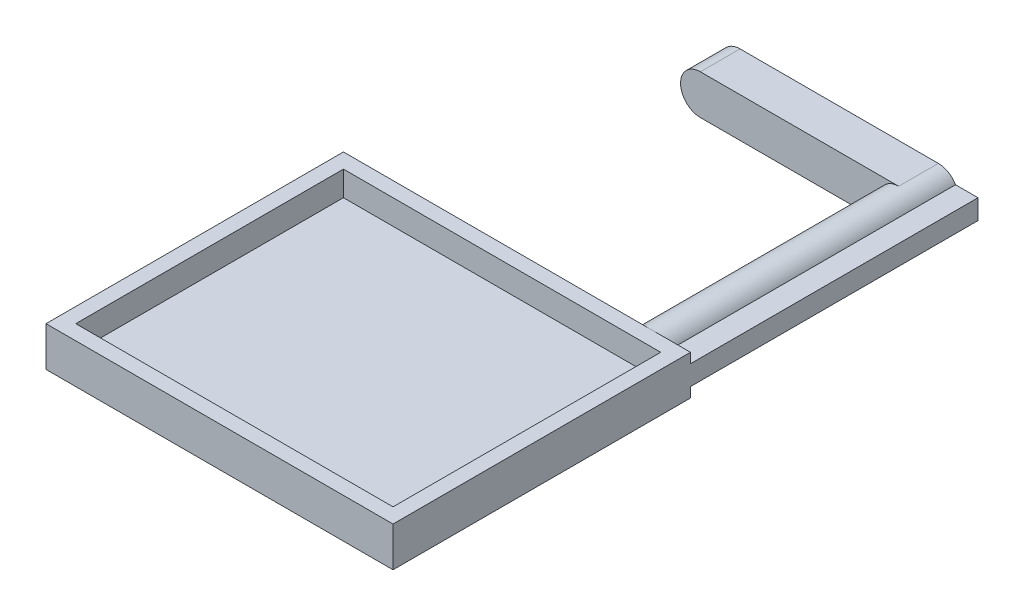
ISO-10303-21;
HEADER;
FILE_DESCRIPTION(('STEP AP214'),'2;1');
FILE_NAME('part.step','',(''),(''),'','','');
FILE_SCHEMA(('AUTOMOTIVE_DESIGN { 1 0 10303 214 1 1 1 1 }'));
ENDSEC;
DATA;
#1=APPLICATION_CONTEXT('core data for automotive mechanical design processes');
#2=APPLICATION_PROTOCOL_DEFINITION('international standard','automotive_design',2000,#1);
#3=PRODUCT_CONTEXT('',#1,'mechanical');
#4=PRODUCT('Part','Part','',(#3));
#5=PRODUCT_RELATED_PRODUCT_CATEGORY('part','',(#4));
#6=PRODUCT_DEFINITION_FORMATION('','',#4);
#7=PRODUCT_DEFINITION_CONTEXT('part definition',#1,'design');
#8=PRODUCT_DEFINITION('design','',#6,#7);
#9=PRODUCT_DEFINITION_SHAPE('','',#8);
#10=(LENGTH_UNIT() NAMED_UNIT(*) SI_UNIT(.MILLI.,.METRE.));
#11=(NAMED_UNIT(*) PLANE_ANGLE_UNIT() SI_UNIT($,.RADIAN.));
#12=(NAMED_UNIT(*) SI_UNIT($,.STERADIAN.) SOLID_ANGLE_UNIT());
#13=UNCERTAINTY_MEASURE_WITH_UNIT(LENGTH_MEASURE(1.E-05),#10,'distance_accuracy_value','');
#14=(GEOMETRIC_REPRESENTATION_CONTEXT(3) GLOBAL_UNCERTAINTY_ASSIGNED_CONTEXT((#13)) GLOBAL_UNIT_ASSIGNED_CONTEXT((#10,
#11,#12)) REPRESENTATION_CONTEXT('',''));
#15=CARTESIAN_POINT('',(0.,0.,0.));
#16=DIRECTION('',(0.,0.,1.));
#17=DIRECTION('',(1.,0.,0.));
#18=AXIS2_PLACEMENT_3D('',#15,#16,#17);
#19=CARTESIAN_POINT('',(0.,0.,5.));
#20=DIRECTION('',(0.,0.,-1.));
#21=DIRECTION('',(-1.,0.,0.));
#22=AXIS2_PLACEMENT_3D('',#19,#20,#21);
#23=CYLINDRICAL_SURFACE('',#22,4.);
#24=DIRECTION('',(0.,0.,-1.));
#25=VECTOR('',#24,1.);
#26=CARTESIAN_POINT('',(3.46410161513775,2.,5.));
#27=LINE('',#26,#25);
#28=CARTESIAN_POINT('',(3.46410161513775,2.,0.));
#29=VERTEX_POINT('',#28);
#30=CARTESIAN_POINT('',(3.46410161513775,2.,-58.));
#31=VERTEX_POINT('',#30);
#32=EDGE_CURVE('E320',#29,#31,#27,.T.);
#33=ORIENTED_EDGE('',*,*,#32,.T.);
#34=CARTESIAN_POINT('',(0.,0.,-58.));
#35=DIRECTION('',(0.,0.,-1.));
#36=DIRECTION('',(-1.,0.,0.));
#37=AXIS2_PLACEMENT_3D('',#34,#35,#36);
#38=CIRCLE('',#37,4.);
#39=CARTESIAN_POINT('',(0.,4.,-58.));
#40=VERTEX_POINT('',#39);
#41=EDGE_CURVE('E282',#40,#31,#38,.T.);
#42=ORIENTED_EDGE('',*,*,#41,.F.);
#43=DIRECTION('',(0.,0.,1.));
#44=VECTOR('',#43,1.);
#45=CARTESIAN_POINT('',(0.,4.,-58.));
#46=LINE('',#45,#44);
#47=CARTESIAN_POINT('',(0.,4.,-50.));
#48=VERTEX_POINT('',#47);
#49=EDGE_CURVE('E298',#40,#48,#46,.T.);
#50=ORIENTED_EDGE('',*,*,#49,.T.);
#51=CARTESIAN_POINT('',(0.,0.,-50.));
#52=DIRECTION('',(0.,0.,1.));
#53=DIRECTION('',(1.,0.,0.));
#54=AXIS2_PLACEMENT_3D('',#51,#52,#53);
#55=CIRCLE('',#54,4.);
#56=CARTESIAN_POINT('',(0.,-4.,-50.));
#57=VERTEX_POINT('',#56);
#58=EDGE_CURVE('E314',#48,#57,#55,.T.);
#59=ORIENTED_EDGE('',*,*,#58,.T.);
#60=DIRECTION('',(0.,0.,1.));
#61=VECTOR('',#60,1.);
#62=CARTESIAN_POINT('',(0.,-4.,-58.));
#63=LINE('',#62,#61);
#64=CARTESIAN_POINT('',(0.,-4.,-58.));
#65=VERTEX_POINT('',#64);
#66=EDGE_CURVE('E296',#65,#57,#63,.T.);
#67=ORIENTED_EDGE('',*,*,#66,.F.);
#68=CARTESIAN_POINT('',(3.46410161513775,-2.,-58.));
#69=VERTEX_POINT('',#68);
#70=EDGE_CURVE('E281',#69,#65,#38,.T.);
#71=ORIENTED_EDGE('',*,*,#70,.F.);
#72=DIRECTION('',(0.,0.,-1.));
#73=VECTOR('',#72,1.);
#74=CARTESIAN_POINT('',(3.46410161513775,-2.,5.));
#75=LINE('',#74,#73);
#76=CARTESIAN_POINT('',(3.46410161513775,-2.,0.));
#77=VERTEX_POINT('',#76);
#78=EDGE_CURVE('E11',#77,#69,#75,.T.);
#79=ORIENTED_EDGE('',*,*,#78,.F.);
#80=CARTESIAN_POINT('',(0.,0.,0.));
#81=DIRECTION('',(0.,0.,1.));
#82=DIRECTION('',(1.,0.,0.));
#83=AXIS2_PLACEMENT_3D('',#80,#81,#82);
#84=CIRCLE('',#83,4.);
#85=CARTESIAN_POINT('',(0.,-4.,0.));
#86=VERTEX_POINT('',#85);
#87=EDGE_CURVE('E66',#86,#77,#84,.T.);
#88=ORIENTED_EDGE('',*,*,#87,.F.);
#89=CARTESIAN_POINT('',(0.,4.,0.));
#90=VERTEX_POINT('',#89);
#91=EDGE_CURVE('E315',#90,#86,#84,.T.);
#92=ORIENTED_EDGE('',*,*,#91,.F.);
#93=EDGE_CURVE('E311',#29,#90,#84,.T.);
#94=ORIENTED_EDGE('',*,*,#93,.F.);
#95=EDGE_LOOP('',(#33,#42,#50,#59,#67,#71,#79,#88,#92,#94));
#96=FACE_BOUND('',#95,.T.);
#97=ADVANCED_FACE('F42',(#96),#23,.T.);
#98=CARTESIAN_POINT('',(8.,-2.,5.));
#99=DIRECTION('',(0.,1.,0.));
#100=DIRECTION('',(0.,0.,1.));
#101=AXIS2_PLACEMENT_3D('',#98,#99,#100);
#102=PLANE('',#101);
#103=DIRECTION('',(1.,0.,0.));
#104=VECTOR('',#103,1.);
#105=CARTESIAN_POINT('',(8.,-2.,0.));
#106=LINE('',#105,#104);
#107=CARTESIAN_POINT('',(8.,-2.,0.));
#108=VERTEX_POINT('',#107);
#109=EDGE_CURVE('E308',#77,#108,#106,.T.);
#110=ORIENTED_EDGE('',*,*,#109,.F.);
#111=ORIENTED_EDGE('',*,*,#78,.T.);
#112=DIRECTION('',(-1.,0.,0.));
#113=VECTOR('',#112,1.);
#114=CARTESIAN_POINT('',(8.,-2.,-58.));
#115=LINE('',#114,#113);
#116=CARTESIAN_POINT('',(8.,-2.,-58.));
#117=VERTEX_POINT('',#116);
#118=EDGE_CURVE('E235',#117,#69,#115,.T.);
#119=ORIENTED_EDGE('',*,*,#118,.F.);
#120=DIRECTION('',(0.,0.,-1.));
#121=VECTOR('',#120,1.);
#122=CARTESIAN_POINT('',(8.,-2.,5.));
#123=LINE('',#122,#121);
#124=EDGE_CURVE('E51',#108,#117,#123,.T.);
#125=ORIENTED_EDGE('',*,*,#124,.F.);
#126=EDGE_LOOP('',(#110,#111,#119,#125));
#127=FACE_BOUND('',#126,.T.);
#128=ADVANCED_FACE('F331',(#127),#102,.F.);
#129=CARTESIAN_POINT('',(8.,2.,5.));
#130=DIRECTION('',(-1.,0.,0.));
#131=DIRECTION('',(0.,0.,1.));
#132=AXIS2_PLACEMENT_3D('',#129,#130,#131);
#133=PLANE('',#132);
#134=DIRECTION('',(0.,0.,-1.));
#135=VECTOR('',#134,1.);
#136=CARTESIAN_POINT('',(8.,2.,5.));
#137=LINE('',#136,#135);
#138=CARTESIAN_POINT('',(8.,2.,0.));
#139=VERTEX_POINT('',#138);
#140=CARTESIAN_POINT('',(8.,2.,-58.));
#141=VERTEX_POINT('',#140);
#142=EDGE_CURVE('E322',#139,#141,#137,.T.);
#143=ORIENTED_EDGE('',*,*,#142,.F.);
#144=DIRECTION('',(0.,1.,0.));
#145=VECTOR('',#144,1.);
#146=CARTESIAN_POINT('',(8.,4.,0.));
#147=LINE('',#146,#145);
#148=CARTESIAN_POINT('',(8.,4.,0.));
#149=VERTEX_POINT('',#148);
#150=EDGE_CURVE('E197',#139,#149,#147,.T.);
#151=ORIENTED_EDGE('',*,*,#150,.T.);
#152=DIRECTION('',(0.,0.,-1.));
#153=VECTOR('',#152,1.);
#154=CARTESIAN_POINT('',(8.,4.,60.));
#155=LINE('',#154,#153);
#156=CARTESIAN_POINT('',(8.,4.,60.));
#157=VERTEX_POINT('',#156);
#158=EDGE_CURVE('E232',#157,#149,#155,.T.);
#159=ORIENTED_EDGE('',*,*,#158,.F.);
#160=DIRECTION('',(0.,1.,0.));
#161=VECTOR('',#160,1.);
#162=CARTESIAN_POINT('',(8.,4.,60.));
#163=LINE('',#162,#161);
#164=CARTESIAN_POINT('',(8.,-4.,60.));
#165=VERTEX_POINT('',#164);
#166=EDGE_CURVE('E201',#165,#157,#163,.T.);
#167=ORIENTED_EDGE('',*,*,#166,.F.);
#168=DIRECTION('',(0.,0.,-1.));
#169=VECTOR('',#168,1.);
#170=CARTESIAN_POINT('',(8.,-4.,60.));
#171=LINE('',#170,#169);
#172=CARTESIAN_POINT('',(8.,-4.,0.));
#173=VERTEX_POINT('',#172);
#174=EDGE_CURVE('E211',#165,#173,#171,.T.);
#175=ORIENTED_EDGE('',*,*,#174,.T.);
#176=EDGE_CURVE('E212',#173,#108,#147,.T.);
#177=ORIENTED_EDGE('',*,*,#176,.T.);
#178=ORIENTED_EDGE('',*,*,#124,.T.);
#179=DIRECTION('',(0.,-1.,0.));
#180=VECTOR('',#179,1.);
#181=CARTESIAN_POINT('',(8.,2.,-58.));
#182=LINE('',#181,#180);
#183=EDGE_CURVE('E236',#141,#117,#182,.T.);
#184=ORIENTED_EDGE('',*,*,#183,.F.);
#185=EDGE_LOOP('',(#143,#151,#159,#167,#175,#177,#178,#184));
#186=FACE_BOUND('',#185,.T.);
#187=ADVANCED_FACE('F328',(#186),#133,.F.);
#188=CARTESIAN_POINT('',(3.46410161513775,2.,5.));
#189=DIRECTION('',(0.,-1.,0.));
#190=DIRECTION('',(0.,0.,-1.));
#191=AXIS2_PLACEMENT_3D('',#188,#189,#190);
#192=PLANE('',#191);
#193=DIRECTION('',(-1.,0.,0.));
#194=VECTOR('',#193,1.);
#195=CARTESIAN_POINT('',(3.46410161513775,2.,0.));
#196=LINE('',#195,#194);
#197=EDGE_CURVE('E305',#139,#29,#196,.T.);
#198=ORIENTED_EDGE('',*,*,#197,.F.);
#199=ORIENTED_EDGE('',*,*,#142,.T.);
#200=DIRECTION('',(1.,0.,0.));
#201=VECTOR('',#200,1.);
#202=CARTESIAN_POINT('',(3.46410161513775,2.,-58.));
#203=LINE('',#202,#201);
#204=EDGE_CURVE('E240',#31,#141,#203,.T.);
#205=ORIENTED_EDGE('',*,*,#204,.F.);
#206=ORIENTED_EDGE('',*,*,#32,.F.);
#207=EDGE_LOOP('',(#198,#199,#205,#206));
#208=FACE_BOUND('',#207,.T.);
#209=ADVANCED_FACE('F338',(#208),#192,.F.);
#210=CARTESIAN_POINT('',(-40.,0.,-50.));
#211=DIRECTION('',(0.,0.,-1.));
#212=DIRECTION('',(-1.,0.,0.));
#213=AXIS2_PLACEMENT_3D('',#210,#211,#212);
#214=PLANE('',#213);
#215=ORIENTED_EDGE('',*,*,#58,.F.);
#216=DIRECTION('',(1.,0.,0.));
#217=VECTOR('',#216,1.);
#218=CARTESIAN_POINT('',(-40.,3.99999999999999,-50.));
#219=LINE('',#218,#217);
#220=CARTESIAN_POINT('',(-40.,3.99999999999999,-50.));
#221=VERTEX_POINT('',#220);
#222=EDGE_CURVE('E290',#221,#48,#219,.T.);
#223=ORIENTED_EDGE('',*,*,#222,.F.);
#224=CARTESIAN_POINT('',(-40.,0.,-50.));
#225=DIRECTION('',(0.,0.,-1.));
#226=DIRECTION('',(-1.,0.,0.));
#227=AXIS2_PLACEMENT_3D('',#224,#225,#226);
#228=CIRCLE('',#227,3.99999999999999);
#229=CARTESIAN_POINT('',(-40.,-3.99999999999999,-50.));
#230=VERTEX_POINT('',#229);
#231=EDGE_CURVE('E248',#230,#221,#228,.T.);
#232=ORIENTED_EDGE('',*,*,#231,.F.);
#233=DIRECTION('',(-1.,0.,0.));
#234=VECTOR('',#233,1.);
#235=CARTESIAN_POINT('',(-40.,-3.99999999999999,-50.));
#236=LINE('',#235,#234);
#237=EDGE_CURVE('E279',#57,#230,#236,.T.);
#238=ORIENTED_EDGE('',*,*,#237,.F.);
#239=EDGE_LOOP('',(#215,#223,#232,#238));
#240=FACE_BOUND('',#239,.T.);
#241=ADVANCED_FACE('F403',(#240),#214,.F.);
#242=CARTESIAN_POINT('',(-40.,0.,-58.));
#243=DIRECTION('',(0.,0.,-1.));
#244=DIRECTION('',(-1.,0.,0.));
#245=AXIS2_PLACEMENT_3D('',#242,#243,#244);
#246=PLANE('',#245);
#247=CARTESIAN_POINT('',(0.,0.,-58.));
#248=DIRECTION('',(0.,0.,-1.));
#249=DIRECTION('',(-1.,0.,0.));
#250=AXIS2_PLACEMENT_3D('',#247,#248,#249);
#251=CIRCLE('',#250,3.1);
#252=CARTESIAN_POINT('',(-3.1,0.,-58.));
#253=VERTEX_POINT('',#252);
#254=EDGE_CURVE('E249',#253,#253,#251,.T.);
#255=ORIENTED_EDGE('',*,*,#254,.F.);
#256=EDGE_LOOP('',(#255));
#257=FACE_BOUND('',#256,.T.);
#258=CARTESIAN_POINT('',(-30.,0.,-58.));
#259=DIRECTION('',(0.,0.,-1.));
#260=DIRECTION('',(-1.,0.,0.));
#261=AXIS2_PLACEMENT_3D('',#258,#259,#260);
#262=CIRCLE('',#261,3.1);
#263=CARTESIAN_POINT('',(-33.1,0.,-58.));
#264=VERTEX_POINT('',#263);
#265=EDGE_CURVE('E260',#264,#264,#262,.T.);
#266=ORIENTED_EDGE('',*,*,#265,.F.);
#267=EDGE_LOOP('',(#266));
#268=FACE_BOUND('',#267,.T.);
#269=CARTESIAN_POINT('',(-10.,0.,-58.));
#270=DIRECTION('',(0.,0.,-1.));
#271=DIRECTION('',(-1.,0.,0.));
#272=AXIS2_PLACEMENT_3D('',#269,#270,#271);
#273=CIRCLE('',#272,3.1);
#274=CARTESIAN_POINT('',(-13.1,0.,-58.));
#275=VERTEX_POINT('',#274);
#276=EDGE_CURVE('E253',#275,#275,#273,.T.);
#277=ORIENTED_EDGE('',*,*,#276,.F.);
#278=EDGE_LOOP('',(#277));
#279=FACE_BOUND('',#278,.T.);
#280=CARTESIAN_POINT('',(-20.,0.,-58.));
#281=DIRECTION('',(0.,0.,-1.));
#282=DIRECTION('',(-1.,0.,0.));
#283=AXIS2_PLACEMENT_3D('',#280,#281,#282);
#284=CIRCLE('',#283,3.1);
#285=CARTESIAN_POINT('',(-23.1,0.,-58.));
#286=VERTEX_POINT('',#285);
#287=EDGE_CURVE('E270',#286,#286,#284,.T.);
#288=ORIENTED_EDGE('',*,*,#287,.F.);
#289=EDGE_LOOP('',(#288));
#290=FACE_BOUND('',#289,.T.);
#291=CARTESIAN_POINT('',(-40.,0.,-58.));
#292=DIRECTION('',(0.,0.,-1.));
#293=DIRECTION('',(-1.,0.,0.));
#294=AXIS2_PLACEMENT_3D('',#291,#292,#293);
#295=CIRCLE('',#294,3.1);
#296=CARTESIAN_POINT('',(-43.1,0.,-58.));
#297=VERTEX_POINT('',#296);
#298=EDGE_CURVE('E252',#297,#297,#295,.T.);
#299=ORIENTED_EDGE('',*,*,#298,.F.);
#300=EDGE_LOOP('',(#299));
#301=FACE_BOUND('',#300,.T.);
#302=CARTESIAN_POINT('',(-40.,0.,-58.));
#303=DIRECTION('',(0.,0.,-1.));
#304=DIRECTION('',(-1.,0.,0.));
#305=AXIS2_PLACEMENT_3D('',#302,#303,#304);
#306=CIRCLE('',#305,3.99999999999999);
#307=CARTESIAN_POINT('',(-40.,-3.99999999999999,-58.));
#308=VERTEX_POINT('',#307);
#309=CARTESIAN_POINT('',(-40.,3.99999999999999,-58.));
#310=VERTEX_POINT('',#309);
#311=EDGE_CURVE('E275',#308,#310,#306,.T.);
#312=ORIENTED_EDGE('',*,*,#311,.T.);
#313=DIRECTION('',(1.,0.,0.));
#314=VECTOR('',#313,1.);
#315=CARTESIAN_POINT('',(-40.,3.99999999999999,-58.));
#316=LINE('',#315,#314);
#317=EDGE_CURVE('E278',#310,#40,#316,.T.);
#318=ORIENTED_EDGE('',*,*,#317,.T.);
#319=ORIENTED_EDGE('',*,*,#41,.T.);
#320=ORIENTED_EDGE('',*,*,#204,.T.);
#321=ORIENTED_EDGE('',*,*,#183,.T.);
#322=ORIENTED_EDGE('',*,*,#118,.T.);
#323=ORIENTED_EDGE('',*,*,#70,.T.);
#324=DIRECTION('',(-1.,0.,0.));
#325=VECTOR('',#324,1.);
#326=CARTESIAN_POINT('',(-40.,-3.99999999999999,-58.));
#327=LINE('',#326,#325);
#328=EDGE_CURVE('E285',#65,#308,#327,.T.);
#329=ORIENTED_EDGE('',*,*,#328,.T.);
#330=EDGE_LOOP('',(#312,#318,#319,#320,#321,#322,#323,#329));
#331=FACE_BOUND('',#330,.T.);
#332=ADVANCED_FACE('F334',(#257,#268,#279,#290,#301,#331),#246,.T.);
#333=CARTESIAN_POINT('',(-40.,-3.99999999999999,-58.));
#334=DIRECTION('',(0.,1.,0.));
#335=DIRECTION('',(-1.,0.,0.));
#336=AXIS2_PLACEMENT_3D('',#333,#334,#335);
#337=PLANE('',#336);
#338=ORIENTED_EDGE('',*,*,#237,.T.);
#339=DIRECTION('',(0.,0.,1.));
#340=VECTOR('',#339,1.);
#341=CARTESIAN_POINT('',(-40.,-3.99999999999999,-58.));
#342=LINE('',#341,#340);
#343=EDGE_CURVE('E287',#308,#230,#342,.T.);
#344=ORIENTED_EDGE('',*,*,#343,.F.);
#345=ORIENTED_EDGE('',*,*,#328,.F.);
#346=ORIENTED_EDGE('',*,*,#66,.T.);
#347=EDGE_LOOP('',(#338,#344,#345,#346));
#348=FACE_BOUND('',#347,.T.);
#349=ADVANCED_FACE('F368',(#348),#337,.F.);
#350=CARTESIAN_POINT('',(-40.,3.99999999999999,-58.));
#351=DIRECTION('',(0.,-1.,0.));
#352=DIRECTION('',(1.,0.,0.));
#353=AXIS2_PLACEMENT_3D('',#350,#351,#352);
#354=PLANE('',#353);
#355=ORIENTED_EDGE('',*,*,#222,.T.);
#356=ORIENTED_EDGE('',*,*,#49,.F.);
#357=ORIENTED_EDGE('',*,*,#317,.F.);
#358=DIRECTION('',(0.,0.,1.));
#359=VECTOR('',#358,1.);
#360=CARTESIAN_POINT('',(-40.,3.99999999999999,-58.));
#361=LINE('',#360,#359);
#362=EDGE_CURVE('E301',#310,#221,#361,.T.);
#363=ORIENTED_EDGE('',*,*,#362,.T.);
#364=EDGE_LOOP('',(#355,#356,#357,#363));
#365=FACE_BOUND('',#364,.T.);
#366=ADVANCED_FACE('F374',(#365),#354,.F.);
#367=CARTESIAN_POINT('',(-40.,0.,-58.));
#368=DIRECTION('',(0.,0.,1.));
#369=DIRECTION('',(1.,0.,0.));
#370=AXIS2_PLACEMENT_3D('',#367,#368,#369);
#371=CYLINDRICAL_SURFACE('',#370,3.99999999999999);
#372=ORIENTED_EDGE('',*,*,#231,.T.);
#373=ORIENTED_EDGE('',*,*,#362,.F.);
#374=ORIENTED_EDGE('',*,*,#311,.F.);
#375=ORIENTED_EDGE('',*,*,#343,.T.);
#376=EDGE_LOOP('',(#372,#373,#374,#375));
#377=FACE_BOUND('',#376,.T.);
#378=ADVANCED_FACE('F372',(#377),#371,.T.);
#379=CARTESIAN_POINT('',(-40.,0.,-54.95));
#380=DIRECTION('',(0.,0.,-1.));
#381=DIRECTION('',(-1.,0.,0.));
#382=AXIS2_PLACEMENT_3D('',#379,#380,#381);
#383=CYLINDRICAL_SURFACE('',#382,3.1);
#384=CARTESIAN_POINT('',(-40.,0.,-54.95));
#385=DIRECTION('',(0.,0.,-1.));
#386=DIRECTION('',(-1.,0.,0.));
#387=AXIS2_PLACEMENT_3D('',#384,#385,#386);
#388=CIRCLE('',#387,3.1);
#389=CARTESIAN_POINT('',(-43.1,0.,-54.95));
#390=VERTEX_POINT('',#389);
#391=EDGE_CURVE('E267',#390,#390,#388,.T.);
#392=ORIENTED_EDGE('',*,*,#391,.F.);
#393=EDGE_LOOP('',(#392));
#394=FACE_BOUND('',#393,.T.);
#395=ORIENTED_EDGE('',*,*,#298,.T.);
#396=EDGE_LOOP('',(#395));
#397=FACE_BOUND('',#396,.T.);
#398=ADVANCED_FACE('F412',(#394,#397),#383,.F.);
#399=CARTESIAN_POINT('',(-40.,0.,-54.95));
#400=DIRECTION('',(0.,0.,-1.));
#401=DIRECTION('',(-1.,0.,0.));
#402=AXIS2_PLACEMENT_3D('',#399,#400,#401);
#403=PLANE('',#402);
#404=ORIENTED_EDGE('',*,*,#391,.T.);
#405=EDGE_LOOP('',(#404));
#406=FACE_BOUND('',#405,.T.);
#407=ADVANCED_FACE('F430',(#406),#403,.T.);
#408=CARTESIAN_POINT('',(-20.,0.,-54.95));
#409=DIRECTION('',(0.,0.,-1.));
#410=DIRECTION('',(-1.,0.,0.));
#411=AXIS2_PLACEMENT_3D('',#408,#409,#410);
#412=CYLINDRICAL_SURFACE('',#411,3.1);
#413=CARTESIAN_POINT('',(-20.,0.,-54.95));
#414=DIRECTION('',(0.,0.,-1.));
#415=DIRECTION('',(-1.,0.,0.));
#416=AXIS2_PLACEMENT_3D('',#413,#414,#415);
#417=CIRCLE('',#416,3.1);
#418=CARTESIAN_POINT('',(-23.1,0.,-54.95));
#419=VERTEX_POINT('',#418);
#420=EDGE_CURVE('E256',#419,#419,#417,.T.);
#421=ORIENTED_EDGE('',*,*,#420,.F.);
#422=EDGE_LOOP('',(#421));
#423=FACE_BOUND('',#422,.T.);
#424=ORIENTED_EDGE('',*,*,#287,.T.);
#425=EDGE_LOOP('',(#424));
#426=FACE_BOUND('',#425,.T.);
#427=ADVANCED_FACE('F426',(#423,#426),#412,.F.);
#428=CARTESIAN_POINT('',(-20.,0.,-54.95));
#429=DIRECTION('',(0.,0.,-1.));
#430=DIRECTION('',(-1.,0.,0.));
#431=AXIS2_PLACEMENT_3D('',#428,#429,#430);
#432=PLANE('',#431);
#433=ORIENTED_EDGE('',*,*,#420,.T.);
#434=EDGE_LOOP('',(#433));
#435=FACE_BOUND('',#434,.T.);
#436=ADVANCED_FACE('F422',(#435),#432,.T.);
#437=CARTESIAN_POINT('',(-10.,0.,-54.95));
#438=DIRECTION('',(0.,0.,-1.));
#439=DIRECTION('',(-1.,0.,0.));
#440=AXIS2_PLACEMENT_3D('',#437,#438,#439);
#441=CYLINDRICAL_SURFACE('',#440,3.1);
#442=CARTESIAN_POINT('',(-10.,0.,-54.95));
#443=DIRECTION('',(0.,0.,-1.));
#444=DIRECTION('',(-1.,0.,0.));
#445=AXIS2_PLACEMENT_3D('',#442,#443,#444);
#446=CIRCLE('',#445,3.1);
#447=CARTESIAN_POINT('',(-13.1,0.,-54.95));
#448=VERTEX_POINT('',#447);
#449=EDGE_CURVE('E257',#448,#448,#446,.T.);
#450=ORIENTED_EDGE('',*,*,#449,.F.);
#451=EDGE_LOOP('',(#450));
#452=FACE_BOUND('',#451,.T.);
#453=ORIENTED_EDGE('',*,*,#276,.T.);
#454=EDGE_LOOP('',(#453));
#455=FACE_BOUND('',#454,.T.);
#456=ADVANCED_FACE('F425',(#452,#455),#441,.F.);
#457=CARTESIAN_POINT('',(-10.,0.,-54.95));
#458=DIRECTION('',(0.,0.,-1.));
#459=DIRECTION('',(-1.,0.,0.));
#460=AXIS2_PLACEMENT_3D('',#457,#458,#459);
#461=PLANE('',#460);
#462=ORIENTED_EDGE('',*,*,#449,.T.);
#463=EDGE_LOOP('',(#462));
#464=FACE_BOUND('',#463,.T.);
#465=ADVANCED_FACE('F446',(#464),#461,.T.);
#466=CARTESIAN_POINT('',(-30.,0.,-54.95));
#467=DIRECTION('',(0.,0.,-1.));
#468=DIRECTION('',(-1.,0.,0.));
#469=AXIS2_PLACEMENT_3D('',#466,#467,#468);
#470=CYLINDRICAL_SURFACE('',#469,3.1);
#471=CARTESIAN_POINT('',(-30.,0.,-54.95));
#472=DIRECTION('',(0.,0.,-1.));
#473=DIRECTION('',(-1.,0.,0.));
#474=AXIS2_PLACEMENT_3D('',#471,#472,#473);
#475=CIRCLE('',#474,3.1);
#476=CARTESIAN_POINT('',(-33.1,0.,-54.95));
#477=VERTEX_POINT('',#476);
#478=EDGE_CURVE('E239',#477,#477,#475,.T.);
#479=ORIENTED_EDGE('',*,*,#478,.F.);
#480=EDGE_LOOP('',(#479));
#481=FACE_BOUND('',#480,.T.);
#482=ORIENTED_EDGE('',*,*,#265,.T.);
#483=EDGE_LOOP('',(#482));
#484=FACE_BOUND('',#483,.T.);
#485=ADVANCED_FACE('F442',(#481,#484),#470,.F.);
#486=CARTESIAN_POINT('',(-30.,0.,-54.95));
#487=DIRECTION('',(0.,0.,-1.));
#488=DIRECTION('',(-1.,0.,0.));
#489=AXIS2_PLACEMENT_3D('',#486,#487,#488);
#490=PLANE('',#489);
#491=ORIENTED_EDGE('',*,*,#478,.T.);
#492=EDGE_LOOP('',(#491));
#493=FACE_BOUND('',#492,.T.);
#494=ADVANCED_FACE('F438',(#493),#490,.T.);
#495=CARTESIAN_POINT('',(0.,0.,-54.95));
#496=DIRECTION('',(0.,0.,-1.));
#497=DIRECTION('',(-1.,0.,0.));
#498=AXIS2_PLACEMENT_3D('',#495,#496,#497);
#499=CYLINDRICAL_SURFACE('',#498,3.1);
#500=CARTESIAN_POINT('',(0.,0.,-54.95));
#501=DIRECTION('',(0.,0.,-1.));
#502=DIRECTION('',(-1.,0.,0.));
#503=AXIS2_PLACEMENT_3D('',#500,#501,#502);
#504=CIRCLE('',#503,3.1);
#505=CARTESIAN_POINT('',(-3.1,0.,-54.95));
#506=VERTEX_POINT('',#505);
#507=EDGE_CURVE('E245',#506,#506,#504,.T.);
#508=ORIENTED_EDGE('',*,*,#507,.F.);
#509=EDGE_LOOP('',(#508));
#510=FACE_BOUND('',#509,.T.);
#511=ORIENTED_EDGE('',*,*,#254,.T.);
#512=EDGE_LOOP('',(#511));
#513=FACE_BOUND('',#512,.T.);
#514=ADVANCED_FACE('F441',(#510,#513),#499,.F.);
#515=CARTESIAN_POINT('',(0.,0.,-54.95));
#516=DIRECTION('',(0.,0.,-1.));
#517=DIRECTION('',(-1.,0.,0.));
#518=AXIS2_PLACEMENT_3D('',#515,#516,#517);
#519=PLANE('',#518);
#520=ORIENTED_EDGE('',*,*,#507,.T.);
#521=EDGE_LOOP('',(#520));
#522=FACE_BOUND('',#521,.T.);
#523=ADVANCED_FACE('F456',(#522),#519,.T.);
#524=CARTESIAN_POINT('',(0.,0.,0.));
#525=DIRECTION('',(0.,0.,-1.));
#526=DIRECTION('',(-1.,0.,0.));
#527=AXIS2_PLACEMENT_3D('',#524,#525,#526);
#528=PLANE('',#527);
#529=ORIENTED_EDGE('',*,*,#197,.T.);
#530=ORIENTED_EDGE('',*,*,#93,.T.);
#531=DIRECTION('',(-1.,0.,0.));
#532=VECTOR('',#531,1.);
#533=CARTESIAN_POINT('',(8.,4.,0.));
#534=LINE('',#533,#532);
#535=EDGE_CURVE('E216',#149,#90,#534,.T.);
#536=ORIENTED_EDGE('',*,*,#535,.F.);
#537=ORIENTED_EDGE('',*,*,#150,.F.);
#538=EDGE_LOOP('',(#529,#530,#536,#537));
#539=FACE_BOUND('',#538,.T.);
#540=ADVANCED_FACE('F344',(#539),#528,.T.);
#541=CARTESIAN_POINT('',(0.,0.,60.));
#542=DIRECTION('',(0.,0.,-1.));
#543=DIRECTION('',(-1.,0.,0.));
#544=AXIS2_PLACEMENT_3D('',#541,#542,#543);
#545=PLANE('',#544);
#546=ORIENTED_EDGE('',*,*,#166,.T.);
#547=DIRECTION('',(-1.,0.,0.));
#548=VECTOR('',#547,1.);
#549=CARTESIAN_POINT('',(8.,4.,60.));
#550=LINE('',#549,#548);
#551=CARTESIAN_POINT('',(-62.,3.99999999999999,60.));
#552=VERTEX_POINT('',#551);
#553=EDGE_CURVE('E204',#157,#552,#550,.T.);
#554=ORIENTED_EDGE('',*,*,#553,.T.);
#555=DIRECTION('',(0.,-1.,0.));
#556=VECTOR('',#555,1.);
#557=CARTESIAN_POINT('',(-62.,3.99999999999999,60.));
#558=LINE('',#557,#556);
#559=CARTESIAN_POINT('',(-62.,-4.00000000000001,60.));
#560=VERTEX_POINT('',#559);
#561=EDGE_CURVE('E207',#552,#560,#558,.T.);
#562=ORIENTED_EDGE('',*,*,#561,.T.);
#563=DIRECTION('',(1.,0.,0.));
#564=VECTOR('',#563,1.);
#565=CARTESIAN_POINT('',(8.,-4.,60.));
#566=LINE('',#565,#564);
#567=EDGE_CURVE('E209',#560,#165,#566,.T.);
#568=ORIENTED_EDGE('',*,*,#567,.T.);
#569=EDGE_LOOP('',(#546,#554,#562,#568));
#570=FACE_BOUND('',#569,.T.);
#571=ADVANCED_FACE('F352',(#570),#545,.F.);
#572=CARTESIAN_POINT('',(8.,-4.,60.));
#573=DIRECTION('',(0.,1.,0.));
#574=DIRECTION('',(-1.,0.,0.));
#575=AXIS2_PLACEMENT_3D('',#572,#573,#574);
#576=PLANE('',#575);
#577=DIRECTION('',(1.,0.,0.));
#578=VECTOR('',#577,1.);
#579=CARTESIAN_POINT('',(8.,-4.,0.));
#580=LINE('',#579,#578);
#581=CARTESIAN_POINT('',(-62.,-4.00000000000001,0.));
#582=VERTEX_POINT('',#581);
#583=EDGE_CURVE('E205',#582,#86,#580,.T.);
#584=ORIENTED_EDGE('',*,*,#583,.T.);
#585=EDGE_CURVE('E221',#86,#173,#580,.T.);
#586=ORIENTED_EDGE('',*,*,#585,.T.);
#587=ORIENTED_EDGE('',*,*,#174,.F.);
#588=ORIENTED_EDGE('',*,*,#567,.F.);
#589=DIRECTION('',(0.,0.,-1.));
#590=VECTOR('',#589,1.);
#591=CARTESIAN_POINT('',(-62.,-4.00000000000001,60.));
#592=LINE('',#591,#590);
#593=EDGE_CURVE('E226',#560,#582,#592,.T.);
#594=ORIENTED_EDGE('',*,*,#593,.T.);
#595=EDGE_LOOP('',(#584,#586,#587,#588,#594));
#596=FACE_BOUND('',#595,.T.);
#597=ADVANCED_FACE('F357',(#596),#576,.F.);
#598=CARTESIAN_POINT('',(-62.,3.99999999999999,60.));
#599=DIRECTION('',(1.,0.,0.));
#600=DIRECTION('',(0.,0.,-1.));
#601=AXIS2_PLACEMENT_3D('',#598,#599,#600);
#602=PLANE('',#601);
#603=DIRECTION('',(0.,-1.,0.));
#604=VECTOR('',#603,1.);
#605=CARTESIAN_POINT('',(-62.,3.99999999999999,0.));
#606=LINE('',#605,#604);
#607=CARTESIAN_POINT('',(-62.,3.99999999999999,0.));
#608=VERTEX_POINT('',#607);
#609=EDGE_CURVE('E219',#608,#582,#606,.T.);
#610=ORIENTED_EDGE('',*,*,#609,.T.);
#611=ORIENTED_EDGE('',*,*,#593,.F.);
#612=ORIENTED_EDGE('',*,*,#561,.F.);
#613=DIRECTION('',(0.,0.,-1.));
#614=VECTOR('',#613,1.);
#615=CARTESIAN_POINT('',(-62.,3.99999999999999,60.));
#616=LINE('',#615,#614);
#617=EDGE_CURVE('E229',#552,#608,#616,.T.);
#618=ORIENTED_EDGE('',*,*,#617,.T.);
#619=EDGE_LOOP('',(#610,#611,#612,#618));
#620=FACE_BOUND('',#619,.T.);
#621=ADVANCED_FACE('F380',(#620),#602,.F.);
#622=CARTESIAN_POINT('',(8.,4.,60.));
#623=DIRECTION('',(0.,-1.,0.));
#624=DIRECTION('',(1.,0.,0.));
#625=AXIS2_PLACEMENT_3D('',#622,#623,#624);
#626=PLANE('',#625);
#627=DIRECTION('',(-1.,0.,0.));
#628=VECTOR('',#627,1.);
#629=CARTESIAN_POINT('',(5.,4.,3.));
#630=LINE('',#629,#628);
#631=CARTESIAN_POINT('',(5.,4.,3.));
#632=VERTEX_POINT('',#631);
#633=CARTESIAN_POINT('',(-59.,3.99999999999999,3.00000000000001));
#634=VERTEX_POINT('',#633);
#635=EDGE_CURVE('E191',#632,#634,#630,.T.);
#636=ORIENTED_EDGE('',*,*,#635,.F.);
#637=DIRECTION('',(0.,0.,-1.));
#638=VECTOR('',#637,1.);
#639=CARTESIAN_POINT('',(5.,4.,3.));
#640=LINE('',#639,#638);
#641=CARTESIAN_POINT('',(5.00000000000001,4.,57.));
#642=VERTEX_POINT('',#641);
#643=EDGE_CURVE('E58',#642,#632,#640,.T.);
#644=ORIENTED_EDGE('',*,*,#643,.F.);
#645=DIRECTION('',(1.,0.,0.));
#646=VECTOR('',#645,1.);
#647=CARTESIAN_POINT('',(5.00000000000001,4.,57.));
#648=LINE('',#647,#646);
#649=CARTESIAN_POINT('',(-59.,3.99999999999999,57.));
#650=VERTEX_POINT('',#649);
#651=EDGE_CURVE('E182',#650,#642,#648,.T.);
#652=ORIENTED_EDGE('',*,*,#651,.F.);
#653=DIRECTION('',(0.,0.,1.));
#654=VECTOR('',#653,1.);
#655=CARTESIAN_POINT('',(-59.,3.99999999999999,3.00000000000001));
#656=LINE('',#655,#654);
#657=EDGE_CURVE('E185',#634,#650,#656,.T.);
#658=ORIENTED_EDGE('',*,*,#657,.F.);
#659=EDGE_LOOP('',(#636,#644,#652,#658));
#660=FACE_BOUND('',#659,.T.);
#661=ORIENTED_EDGE('',*,*,#535,.T.);
#662=EDGE_CURVE('E215',#90,#608,#534,.T.);
#663=ORIENTED_EDGE('',*,*,#662,.T.);
#664=ORIENTED_EDGE('',*,*,#617,.F.);
#665=ORIENTED_EDGE('',*,*,#553,.F.);
#666=ORIENTED_EDGE('',*,*,#158,.T.);
#667=EDGE_LOOP('',(#661,#663,#664,#665,#666));
#668=FACE_BOUND('',#667,.T.);
#669=ADVANCED_FACE('F347',(#660,#668),#626,.F.);
#670=ORIENTED_EDGE('',*,*,#662,.F.);
#671=ORIENTED_EDGE('',*,*,#91,.T.);
#672=ORIENTED_EDGE('',*,*,#583,.F.);
#673=ORIENTED_EDGE('',*,*,#609,.F.);
#674=EDGE_LOOP('',(#670,#671,#672,#673));
#675=FACE_BOUND('',#674,.T.);
#676=ADVANCED_FACE('F377',(#675),#528,.T.);
#677=ORIENTED_EDGE('',*,*,#87,.T.);
#678=ORIENTED_EDGE('',*,*,#109,.T.);
#679=ORIENTED_EDGE('',*,*,#176,.F.);
#680=ORIENTED_EDGE('',*,*,#585,.F.);
#681=EDGE_LOOP('',(#677,#678,#679,#680));
#682=FACE_BOUND('',#681,.T.);
#683=ADVANCED_FACE('F361',(#682),#528,.T.);
#684=CARTESIAN_POINT('',(5.,-0.999999999999999,3.));
#685=DIRECTION('',(1.,0.,0.));
#686=DIRECTION('',(0.,1.,0.));
#687=AXIS2_PLACEMENT_3D('',#684,#685,#686);
#688=PLANE('',#687);
#689=ORIENTED_EDGE('',*,*,#643,.T.);
#690=DIRECTION('',(0.,1.,0.));
#691=VECTOR('',#690,1.);
#692=CARTESIAN_POINT('',(5.,-0.999999999999999,3.));
#693=LINE('',#692,#691);
#694=CARTESIAN_POINT('',(5.,-0.999999999999999,3.));
#695=VERTEX_POINT('',#694);
#696=EDGE_CURVE('E160',#695,#632,#693,.T.);
#697=ORIENTED_EDGE('',*,*,#696,.F.);
#698=DIRECTION('',(0.,0.,-1.));
#699=VECTOR('',#698,1.);
#700=CARTESIAN_POINT('',(5.,-0.999999999999999,3.));
#701=LINE('',#700,#699);
#702=CARTESIAN_POINT('',(5.00000000000001,-0.999999999999999,57.));
#703=VERTEX_POINT('',#702);
#704=EDGE_CURVE('E164',#703,#695,#701,.T.);
#705=ORIENTED_EDGE('',*,*,#704,.F.);
#706=DIRECTION('',(0.,1.,0.));
#707=VECTOR('',#706,1.);
#708=CARTESIAN_POINT('',(5.00000000000001,-0.999999999999999,57.));
#709=LINE('',#708,#707);
#710=EDGE_CURVE('E195',#703,#642,#709,.T.);
#711=ORIENTED_EDGE('',*,*,#710,.T.);
#712=EDGE_LOOP('',(#689,#697,#705,#711));
#713=FACE_BOUND('',#712,.T.);
#714=ADVANCED_FACE('F162',(#713),#688,.F.);
#715=CARTESIAN_POINT('',(5.00000000000001,-0.999999999999999,57.));
#716=DIRECTION('',(0.,0.,1.));
#717=DIRECTION('',(1.,0.,0.));
#718=AXIS2_PLACEMENT_3D('',#715,#716,#717);
#719=PLANE('',#718);
#720=ORIENTED_EDGE('',*,*,#651,.T.);
#721=ORIENTED_EDGE('',*,*,#710,.F.);
#722=DIRECTION('',(1.,0.,0.));
#723=VECTOR('',#722,1.);
#724=CARTESIAN_POINT('',(5.00000000000001,-0.999999999999999,57.));
#725=LINE('',#724,#723);
#726=CARTESIAN_POINT('',(-59.,-1.00000000000001,57.));
#727=VERTEX_POINT('',#726);
#728=EDGE_CURVE('E170',#727,#703,#725,.T.);
#729=ORIENTED_EDGE('',*,*,#728,.F.);
#730=DIRECTION('',(0.,1.,0.));
#731=VECTOR('',#730,1.);
#732=CARTESIAN_POINT('',(-59.,-1.00000000000001,57.));
#733=LINE('',#732,#731);
#734=EDGE_CURVE('E198',#727,#650,#733,.T.);
#735=ORIENTED_EDGE('',*,*,#734,.T.);
#736=EDGE_LOOP('',(#720,#721,#729,#735));
#737=FACE_BOUND('',#736,.T.);
#738=ADVANCED_FACE('F492',(#737),#719,.F.);
#739=CARTESIAN_POINT('',(-59.,-1.00000000000001,3.00000000000001));
#740=DIRECTION('',(-1.,0.,0.));
#741=DIRECTION('',(0.,0.,1.));
#742=AXIS2_PLACEMENT_3D('',#739,#740,#741);
#743=PLANE('',#742);
#744=ORIENTED_EDGE('',*,*,#657,.T.);
#745=ORIENTED_EDGE('',*,*,#734,.F.);
#746=DIRECTION('',(0.,0.,1.));
#747=VECTOR('',#746,1.);
#748=CARTESIAN_POINT('',(-59.,-1.00000000000001,3.00000000000001));
#749=LINE('',#748,#747);
#750=CARTESIAN_POINT('',(-59.,-1.00000000000001,3.00000000000001));
#751=VERTEX_POINT('',#750);
#752=EDGE_CURVE('E178',#751,#727,#749,.T.);
#753=ORIENTED_EDGE('',*,*,#752,.F.);
#754=DIRECTION('',(0.,1.,0.));
#755=VECTOR('',#754,1.);
#756=CARTESIAN_POINT('',(-59.,-1.00000000000001,3.00000000000001));
#757=LINE('',#756,#755);
#758=EDGE_CURVE('E169',#751,#634,#757,.T.);
#759=ORIENTED_EDGE('',*,*,#758,.T.);
#760=EDGE_LOOP('',(#744,#745,#753,#759));
#761=FACE_BOUND('',#760,.T.);
#762=ADVANCED_FACE('F497',(#761),#743,.F.);
#763=CARTESIAN_POINT('',(5.,-0.999999999999999,3.));
#764=DIRECTION('',(0.,0.,-1.));
#765=DIRECTION('',(-1.,0.,0.));
#766=AXIS2_PLACEMENT_3D('',#763,#764,#765);
#767=PLANE('',#766);
#768=ORIENTED_EDGE('',*,*,#635,.T.);
#769=ORIENTED_EDGE('',*,*,#758,.F.);
#770=DIRECTION('',(-1.,0.,0.));
#771=VECTOR('',#770,1.);
#772=CARTESIAN_POINT('',(5.,-0.999999999999999,3.));
#773=LINE('',#772,#771);
#774=EDGE_CURVE('E173',#695,#751,#773,.T.);
#775=ORIENTED_EDGE('',*,*,#774,.F.);
#776=ORIENTED_EDGE('',*,*,#696,.T.);
#777=EDGE_LOOP('',(#768,#769,#775,#776));
#778=FACE_BOUND('',#777,.T.);
#779=ADVANCED_FACE('F174',(#778),#767,.F.);
#780=CARTESIAN_POINT('',(0.,-1.,0.));
#781=DIRECTION('',(0.,-1.,0.));
#782=DIRECTION('',(1.,0.,0.));
#783=AXIS2_PLACEMENT_3D('',#780,#781,#782);
#784=PLANE('',#783);
#785=ORIENTED_EDGE('',*,*,#704,.T.);
#786=ORIENTED_EDGE('',*,*,#774,.T.);
#787=ORIENTED_EDGE('',*,*,#752,.T.);
#788=ORIENTED_EDGE('',*,*,#728,.T.);
#789=EDGE_LOOP('',(#785,#786,#787,#788));
#790=FACE_BOUND('',#789,.T.);
#791=ADVANCED_FACE('F180',(#790),#784,.F.);
#792=CLOSED_SHELL('',(#97,#128,#187,#209,#241,#332,#349,#366,#378,#398,#407,#427,#436,#456,#465,
#485,#494,#514,#523,#540,#571,#597,#621,#669,#676,#683,#714,#738,#762,#779,#791));
#793=CARTESIAN_POINT('',(0.,0.,0.));
#794=DIRECTION('',(0.,0.,1.));
#795=DIRECTION('',(1.,0.,0.));
#796=AXIS2_PLACEMENT_3D('',#793,#794,#795);
#797=CIRCLE('',#796,2.1);
#798=CARTESIAN_POINT('',(2.1,0.,0.));
#799=VERTEX_POINT('',#798);
#800=EDGE_CURVE('E45',#799,#799,#797,.F.);
#801=ORIENTED_EDGE('',*,*,#800,.T.);
#802=EDGE_LOOP('',(#801));
#803=FACE_BOUND('',#802,.T.);
#804=ADVANCED_FACE('F464',(#803),#528,.T.);
#805=CARTESIAN_POINT('',(0.,0.,-50.));
#806=DIRECTION('',(0.,0.,-1.));
#807=DIRECTION('',(-1.,0.,0.));
#808=AXIS2_PLACEMENT_3D('',#805,#806,#807);
#809=CIRCLE('',#808,2.1);
#810=CARTESIAN_POINT('',(-2.1,0.,-50.));
#811=VERTEX_POINT('',#810);
#812=EDGE_CURVE('E304',#811,#811,#809,.T.);
#813=ORIENTED_EDGE('',*,*,#812,.F.);
#814=EDGE_LOOP('',(#813));
#815=FACE_BOUND('',#814,.T.);
#816=ADVANCED_FACE('F407',(#815),#214,.F.);
#817=CARTESIAN_POINT('',(0.,0.,5.));
#818=DIRECTION('',(0.,0.,-1.));
#819=DIRECTION('',(-1.,0.,0.));
#820=AXIS2_PLACEMENT_3D('',#817,#818,#819);
#821=CYLINDRICAL_SURFACE('',#820,2.1);
#822=ORIENTED_EDGE('',*,*,#812,.T.);
#823=EDGE_LOOP('',(#822));
#824=FACE_BOUND('',#823,.T.);
#825=ORIENTED_EDGE('',*,*,#800,.F.);
#826=EDGE_LOOP('',(#825));
#827=FACE_BOUND('',#826,.T.);
#828=ADVANCED_FACE('F404',(#824,#827),#821,.F.);
#829=CLOSED_SHELL('',(#804,#816,#828));
#830=ORIENTED_CLOSED_SHELL('',*,#829,.T.);
#831=BREP_WITH_VOIDS('B2',#792,(#830));
#832=ADVANCED_BREP_SHAPE_REPRESENTATION('',(#18,#831),#14);
#833=SHAPE_DEFINITION_REPRESENTATION(#9,#832);
ENDSEC;
END-ISO-10303-21;
